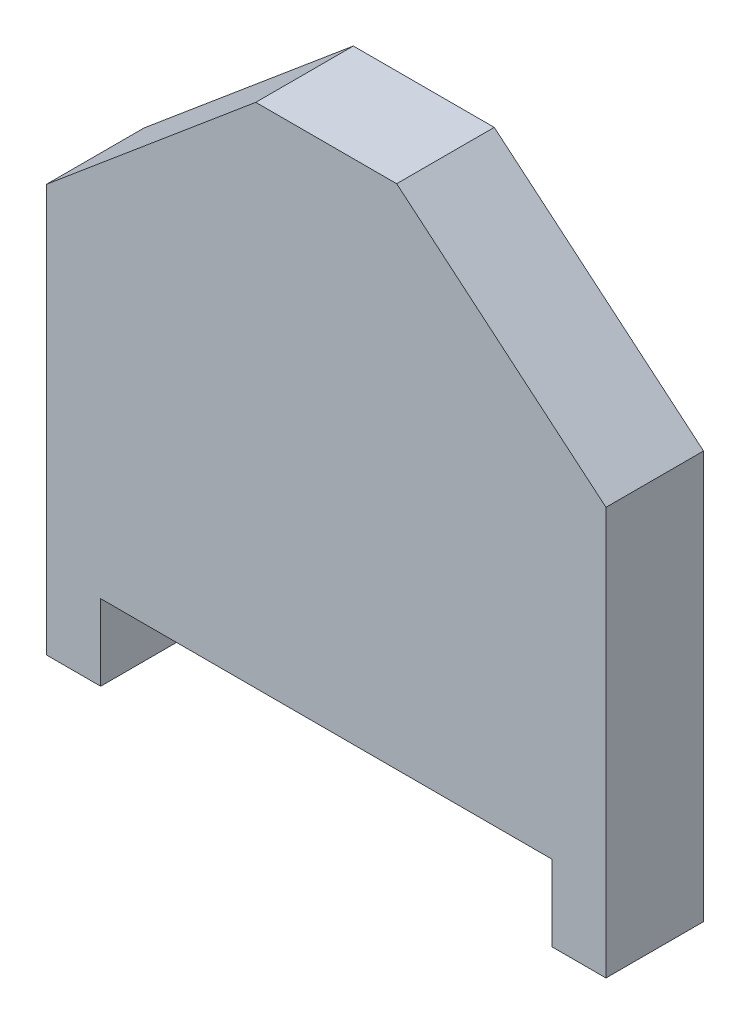
ISO-10303-21;
HEADER;
FILE_DESCRIPTION(('STEP AP214'),'2;1');
FILE_NAME('part.step','',(''),(''),'','','');
FILE_SCHEMA(('AUTOMOTIVE_DESIGN { 1 0 10303 214 1 1 1 1 }'));
ENDSEC;
DATA;
#1=APPLICATION_CONTEXT('core data for automotive mechanical design processes');
#2=APPLICATION_PROTOCOL_DEFINITION('international standard','automotive_design',2000,#1);
#3=PRODUCT_CONTEXT('',#1,'mechanical');
#4=PRODUCT('Part','Part','',(#3));
#5=PRODUCT_RELATED_PRODUCT_CATEGORY('part','',(#4));
#6=PRODUCT_DEFINITION_FORMATION('','',#4);
#7=PRODUCT_DEFINITION_CONTEXT('part definition',#1,'design');
#8=PRODUCT_DEFINITION('design','',#6,#7);
#9=PRODUCT_DEFINITION_SHAPE('','',#8);
#10=(LENGTH_UNIT() NAMED_UNIT(*) SI_UNIT(.MILLI.,.METRE.));
#11=(NAMED_UNIT(*) PLANE_ANGLE_UNIT() SI_UNIT($,.RADIAN.));
#12=(NAMED_UNIT(*) SI_UNIT($,.STERADIAN.) SOLID_ANGLE_UNIT());
#13=UNCERTAINTY_MEASURE_WITH_UNIT(LENGTH_MEASURE(1.E-05),#10,'distance_accuracy_value','');
#14=(GEOMETRIC_REPRESENTATION_CONTEXT(3) GLOBAL_UNCERTAINTY_ASSIGNED_CONTEXT((#13)) GLOBAL_UNIT_ASSIGNED_CONTEXT((#10,
#11,#12)) REPRESENTATION_CONTEXT('',''));
#15=CARTESIAN_POINT('',(0.,0.,0.));
#16=DIRECTION('',(0.,0.,1.));
#17=DIRECTION('',(1.,0.,0.));
#18=AXIS2_PLACEMENT_3D('',#15,#16,#17);
#19=CARTESIAN_POINT('',(362.665793884374,-432.20826277273,45.));
#20=DIRECTION('',(-0.642787609686543,0.766044443118975,0.));
#21=DIRECTION('',(-0.766044443118975,-0.642787609686543,0.));
#22=AXIS2_PLACEMENT_3D('',#19,#20,#21);
#23=PLANE('',#22);
#24=DIRECTION('',(0.766044443118975,0.642787609686543,0.));
#25=VECTOR('',#24,1.);
#26=CARTESIAN_POINT('',(362.665793884374,-432.20826277273,-45.));
#27=LINE('',#26,#25);
#28=CARTESIAN_POINT('',(0.,-736.520996661727,-45.));
#29=VERTEX_POINT('',#28);
#30=CARTESIAN_POINT('',(193.043199665982,-574.538519020718,-45.));
#31=VERTEX_POINT('',#30);
#32=EDGE_CURVE('E144',#29,#31,#27,.T.);
#33=ORIENTED_EDGE('',*,*,#32,.F.);
#34=DIRECTION('',(0.,0.,-1.));
#35=VECTOR('',#34,1.);
#36=CARTESIAN_POINT('',(0.,-736.520996661727,45.));
#37=LINE('',#36,#35);
#38=CARTESIAN_POINT('',(0.,-736.520996661727,45.));
#39=VERTEX_POINT('',#38);
#40=EDGE_CURVE('E11',#39,#29,#37,.T.);
#41=ORIENTED_EDGE('',*,*,#40,.F.);
#42=DIRECTION('',(0.766044443118975,0.642787609686543,0.));
#43=VECTOR('',#42,1.);
#44=CARTESIAN_POINT('',(362.665793884374,-432.20826277273,45.));
#45=LINE('',#44,#43);
#46=CARTESIAN_POINT('',(193.043199665982,-574.538519020718,45.));
#47=VERTEX_POINT('',#46);
#48=EDGE_CURVE('E168',#39,#47,#45,.T.);
#49=ORIENTED_EDGE('',*,*,#48,.T.);
#50=DIRECTION('',(0.,0.,-1.));
#51=VECTOR('',#50,1.);
#52=CARTESIAN_POINT('',(193.043199665982,-574.538519020718,45.));
#53=LINE('',#52,#51);
#54=EDGE_CURVE('E52',#47,#31,#53,.T.);
#55=ORIENTED_EDGE('',*,*,#54,.T.);
#56=EDGE_LOOP('',(#33,#41,#49,#55));
#57=FACE_BOUND('',#56,.T.);
#58=ADVANCED_FACE('F36',(#57),#23,.T.);
#59=CARTESIAN_POINT('',(0.,0.,45.));
#60=DIRECTION('',(1.,0.,0.));
#61=DIRECTION('',(0.,0.,-1.));
#62=AXIS2_PLACEMENT_3D('',#59,#60,#61);
#63=PLANE('',#62);
#64=DIRECTION('',(0.,-1.,0.));
#65=VECTOR('',#64,1.);
#66=CARTESIAN_POINT('',(0.,0.,-45.));
#67=LINE('',#66,#65);
#68=CARTESIAN_POINT('',(0.,-1112.52099666173,-45.));
#69=VERTEX_POINT('',#68);
#70=EDGE_CURVE('E146',#29,#69,#67,.T.);
#71=ORIENTED_EDGE('',*,*,#70,.T.);
#72=DIRECTION('',(0.,0.,-1.));
#73=VECTOR('',#72,1.);
#74=CARTESIAN_POINT('',(0.,-1112.52099666173,45.));
#75=LINE('',#74,#73);
#76=CARTESIAN_POINT('',(0.,-1112.52099666173,45.));
#77=VERTEX_POINT('',#76);
#78=EDGE_CURVE('E44',#77,#69,#75,.T.);
#79=ORIENTED_EDGE('',*,*,#78,.F.);
#80=DIRECTION('',(0.,-1.,0.));
#81=VECTOR('',#80,1.);
#82=CARTESIAN_POINT('',(0.,0.,45.));
#83=LINE('',#82,#81);
#84=EDGE_CURVE('E204',#39,#77,#83,.T.);
#85=ORIENTED_EDGE('',*,*,#84,.F.);
#86=ORIENTED_EDGE('',*,*,#40,.T.);
#87=EDGE_LOOP('',(#71,#79,#85,#86));
#88=FACE_BOUND('',#87,.T.);
#89=ADVANCED_FACE('F225',(#88),#63,.F.);
#90=CARTESIAN_POINT('',(0.,-1112.52099666173,45.));
#91=DIRECTION('',(0.,1.,0.));
#92=DIRECTION('',(0.,0.,1.));
#93=AXIS2_PLACEMENT_3D('',#90,#91,#92);
#94=PLANE('',#93);
#95=DIRECTION('',(1.,0.,0.));
#96=VECTOR('',#95,1.);
#97=CARTESIAN_POINT('',(0.,-1112.52099666173,-45.));
#98=LINE('',#97,#96);
#99=CARTESIAN_POINT('',(50.,-1112.52099666173,-45.));
#100=VERTEX_POINT('',#99);
#101=EDGE_CURVE('E148',#69,#100,#98,.T.);
#102=ORIENTED_EDGE('',*,*,#101,.T.);
#103=DIRECTION('',(0.,0.,-1.));
#104=VECTOR('',#103,1.);
#105=CARTESIAN_POINT('',(50.,-1112.52099666173,45.));
#106=LINE('',#105,#104);
#107=CARTESIAN_POINT('',(50.,-1112.52099666173,45.));
#108=VERTEX_POINT('',#107);
#109=EDGE_CURVE('E178',#108,#100,#106,.T.);
#110=ORIENTED_EDGE('',*,*,#109,.F.);
#111=DIRECTION('',(1.,0.,0.));
#112=VECTOR('',#111,1.);
#113=CARTESIAN_POINT('',(0.,-1112.52099666173,45.));
#114=LINE('',#113,#112);
#115=EDGE_CURVE('E187',#77,#108,#114,.T.);
#116=ORIENTED_EDGE('',*,*,#115,.F.);
#117=ORIENTED_EDGE('',*,*,#78,.T.);
#118=EDGE_LOOP('',(#102,#110,#116,#117));
#119=FACE_BOUND('',#118,.T.);
#120=ADVANCED_FACE('F185',(#119),#94,.F.);
#121=CARTESIAN_POINT('',(50.,0.,45.));
#122=DIRECTION('',(-1.,0.,0.));
#123=DIRECTION('',(0.,0.,1.));
#124=AXIS2_PLACEMENT_3D('',#121,#122,#123);
#125=PLANE('',#124);
#126=DIRECTION('',(0.,1.,0.));
#127=VECTOR('',#126,1.);
#128=CARTESIAN_POINT('',(50.,0.,-45.));
#129=LINE('',#128,#127);
#130=CARTESIAN_POINT('',(50.,-1042.52099666173,-45.));
#131=VERTEX_POINT('',#130);
#132=EDGE_CURVE('E150',#100,#131,#129,.T.);
#133=ORIENTED_EDGE('',*,*,#132,.T.);
#134=DIRECTION('',(0.,0.,-1.));
#135=VECTOR('',#134,1.);
#136=CARTESIAN_POINT('',(50.,-1042.52099666173,45.));
#137=LINE('',#136,#135);
#138=CARTESIAN_POINT('',(50.,-1042.52099666173,45.));
#139=VERTEX_POINT('',#138);
#140=EDGE_CURVE('E176',#139,#131,#137,.T.);
#141=ORIENTED_EDGE('',*,*,#140,.F.);
#142=DIRECTION('',(0.,1.,0.));
#143=VECTOR('',#142,1.);
#144=CARTESIAN_POINT('',(50.,0.,45.));
#145=LINE('',#144,#143);
#146=EDGE_CURVE('E199',#108,#139,#145,.T.);
#147=ORIENTED_EDGE('',*,*,#146,.F.);
#148=ORIENTED_EDGE('',*,*,#109,.T.);
#149=EDGE_LOOP('',(#133,#141,#147,#148));
#150=FACE_BOUND('',#149,.T.);
#151=ADVANCED_FACE('F196',(#150),#125,.F.);
#152=CARTESIAN_POINT('',(1.19914176324439E-12,-1042.52099666173,45.));
#153=DIRECTION('',(0.,-1.,0.));
#154=DIRECTION('',(1.,0.,0.));
#155=AXIS2_PLACEMENT_3D('',#152,#153,#154);
#156=PLANE('',#155);
#157=DIRECTION('',(-1.,0.,0.));
#158=VECTOR('',#157,1.);
#159=CARTESIAN_POINT('',(1.19914176324439E-12,-1042.52099666173,-45.));
#160=LINE('',#159,#158);
#161=CARTESIAN_POINT('',(466.086399331963,-1042.52099666173,-45.));
#162=VERTEX_POINT('',#161);
#163=EDGE_CURVE('E153',#162,#131,#160,.T.);
#164=ORIENTED_EDGE('',*,*,#163,.F.);
#165=DIRECTION('',(0.,0.,-1.));
#166=VECTOR('',#165,1.);
#167=CARTESIAN_POINT('',(466.086399331963,-1042.52099666173,45.));
#168=LINE('',#167,#166);
#169=CARTESIAN_POINT('',(466.086399331963,-1042.52099666173,45.));
#170=VERTEX_POINT('',#169);
#171=EDGE_CURVE('E174',#170,#162,#168,.T.);
#172=ORIENTED_EDGE('',*,*,#171,.F.);
#173=DIRECTION('',(-1.,0.,0.));
#174=VECTOR('',#173,1.);
#175=CARTESIAN_POINT('',(1.19914176324439E-12,-1042.52099666173,45.));
#176=LINE('',#175,#174);
#177=EDGE_CURVE('E201',#170,#139,#176,.T.);
#178=ORIENTED_EDGE('',*,*,#177,.T.);
#179=ORIENTED_EDGE('',*,*,#140,.T.);
#180=EDGE_LOOP('',(#164,#172,#178,#179));
#181=FACE_BOUND('',#180,.T.);
#182=ADVANCED_FACE('F236',(#181),#156,.T.);
#183=CARTESIAN_POINT('',(466.086399331963,0.,45.));
#184=DIRECTION('',(-1.,0.,0.));
#185=DIRECTION('',(0.,0.,1.));
#186=AXIS2_PLACEMENT_3D('',#183,#184,#185);
#187=PLANE('',#186);
#188=DIRECTION('',(0.,1.,0.));
#189=VECTOR('',#188,1.);
#190=CARTESIAN_POINT('',(466.086399331963,0.,-45.));
#191=LINE('',#190,#189);
#192=CARTESIAN_POINT('',(466.086399331963,-1112.52099666173,-45.));
#193=VERTEX_POINT('',#192);
#194=EDGE_CURVE('E156',#193,#162,#191,.T.);
#195=ORIENTED_EDGE('',*,*,#194,.F.);
#196=DIRECTION('',(0.,0.,-1.));
#197=VECTOR('',#196,1.);
#198=CARTESIAN_POINT('',(466.086399331963,-1112.52099666173,45.));
#199=LINE('',#198,#197);
#200=CARTESIAN_POINT('',(466.086399331963,-1112.52099666173,45.));
#201=VERTEX_POINT('',#200);
#202=EDGE_CURVE('E172',#201,#193,#199,.T.);
#203=ORIENTED_EDGE('',*,*,#202,.F.);
#204=DIRECTION('',(0.,1.,0.));
#205=VECTOR('',#204,1.);
#206=CARTESIAN_POINT('',(466.086399331963,0.,45.));
#207=LINE('',#206,#205);
#208=EDGE_CURVE('E139',#201,#170,#207,.T.);
#209=ORIENTED_EDGE('',*,*,#208,.T.);
#210=ORIENTED_EDGE('',*,*,#171,.T.);
#211=EDGE_LOOP('',(#195,#203,#209,#210));
#212=FACE_BOUND('',#211,.T.);
#213=ADVANCED_FACE('F210',(#212),#187,.T.);
#214=CARTESIAN_POINT('',(0.,-1112.52099666173,45.));
#215=DIRECTION('',(0.,-1.,0.));
#216=DIRECTION('',(0.,0.,-1.));
#217=AXIS2_PLACEMENT_3D('',#214,#215,#216);
#218=PLANE('',#217);
#219=DIRECTION('',(-1.,0.,0.));
#220=VECTOR('',#219,1.);
#221=CARTESIAN_POINT('',(0.,-1112.52099666173,-45.));
#222=LINE('',#221,#220);
#223=CARTESIAN_POINT('',(516.086399331963,-1112.52099666173,-45.));
#224=VERTEX_POINT('',#223);
#225=EDGE_CURVE('E159',#224,#193,#222,.T.);
#226=ORIENTED_EDGE('',*,*,#225,.F.);
#227=DIRECTION('',(0.,0.,-1.));
#228=VECTOR('',#227,1.);
#229=CARTESIAN_POINT('',(516.086399331963,-1112.52099666173,45.));
#230=LINE('',#229,#228);
#231=CARTESIAN_POINT('',(516.086399331963,-1112.52099666173,45.));
#232=VERTEX_POINT('',#231);
#233=EDGE_CURVE('E124',#232,#224,#230,.T.);
#234=ORIENTED_EDGE('',*,*,#233,.F.);
#235=DIRECTION('',(-1.,0.,0.));
#236=VECTOR('',#235,1.);
#237=CARTESIAN_POINT('',(0.,-1112.52099666173,45.));
#238=LINE('',#237,#236);
#239=EDGE_CURVE('E137',#232,#201,#238,.T.);
#240=ORIENTED_EDGE('',*,*,#239,.T.);
#241=ORIENTED_EDGE('',*,*,#202,.T.);
#242=EDGE_LOOP('',(#226,#234,#240,#241));
#243=FACE_BOUND('',#242,.T.);
#244=ADVANCED_FACE('F213',(#243),#218,.T.);
#245=CARTESIAN_POINT('',(516.086399331963,0.,45.));
#246=DIRECTION('',(1.,0.,0.));
#247=DIRECTION('',(0.,0.,-1.));
#248=AXIS2_PLACEMENT_3D('',#245,#246,#247);
#249=PLANE('',#248);
#250=DIRECTION('',(0.,-1.,0.));
#251=VECTOR('',#250,1.);
#252=CARTESIAN_POINT('',(516.086399331963,0.,-45.));
#253=LINE('',#252,#251);
#254=CARTESIAN_POINT('',(516.086399331963,-736.520996661727,-45.));
#255=VERTEX_POINT('',#254);
#256=EDGE_CURVE('E121',#255,#224,#253,.T.);
#257=ORIENTED_EDGE('',*,*,#256,.F.);
#258=DIRECTION('',(0.,0.,-1.));
#259=VECTOR('',#258,1.);
#260=CARTESIAN_POINT('',(516.086399331963,-736.520996661727,45.));
#261=LINE('',#260,#259);
#262=CARTESIAN_POINT('',(516.086399331963,-736.520996661727,45.));
#263=VERTEX_POINT('',#262);
#264=EDGE_CURVE('E115',#263,#255,#261,.T.);
#265=ORIENTED_EDGE('',*,*,#264,.F.);
#266=DIRECTION('',(0.,-1.,0.));
#267=VECTOR('',#266,1.);
#268=CARTESIAN_POINT('',(516.086399331963,0.,45.));
#269=LINE('',#268,#267);
#270=EDGE_CURVE('E119',#263,#232,#269,.T.);
#271=ORIENTED_EDGE('',*,*,#270,.T.);
#272=ORIENTED_EDGE('',*,*,#233,.T.);
#273=EDGE_LOOP('',(#257,#265,#271,#272));
#274=FACE_BOUND('',#273,.T.);
#275=ADVANCED_FACE('F117',(#274),#249,.T.);
#276=CARTESIAN_POINT('',(-149.431325599732,-178.085319129594,45.));
#277=DIRECTION('',(-0.642787609686543,-0.766044443118975,0.));
#278=DIRECTION('',(0.766044443118975,-0.642787609686543,0.));
#279=AXIS2_PLACEMENT_3D('',#276,#277,#278);
#280=PLANE('',#279);
#281=DIRECTION('',(-0.766044443118975,0.642787609686543,0.));
#282=VECTOR('',#281,1.);
#283=CARTESIAN_POINT('',(-149.431325599732,-178.085319129594,-45.));
#284=LINE('',#283,#282);
#285=CARTESIAN_POINT('',(323.043199665982,-574.538519020718,-45.));
#286=VERTEX_POINT('',#285);
#287=EDGE_CURVE('E163',#255,#286,#284,.T.);
#288=ORIENTED_EDGE('',*,*,#287,.T.);
#289=DIRECTION('',(0.,0.,-1.));
#290=VECTOR('',#289,1.);
#291=CARTESIAN_POINT('',(323.043199665982,-574.538519020718,45.));
#292=LINE('',#291,#290);
#293=CARTESIAN_POINT('',(323.043199665982,-574.538519020718,45.));
#294=VERTEX_POINT('',#293);
#295=EDGE_CURVE('E84',#294,#286,#292,.T.);
#296=ORIENTED_EDGE('',*,*,#295,.F.);
#297=DIRECTION('',(-0.766044443118975,0.642787609686543,0.));
#298=VECTOR('',#297,1.);
#299=CARTESIAN_POINT('',(-149.431325599732,-178.085319129594,45.));
#300=LINE('',#299,#298);
#301=EDGE_CURVE('E126',#263,#294,#300,.T.);
#302=ORIENTED_EDGE('',*,*,#301,.F.);
#303=ORIENTED_EDGE('',*,*,#264,.T.);
#304=EDGE_LOOP('',(#288,#296,#302,#303));
#305=FACE_BOUND('',#304,.T.);
#306=ADVANCED_FACE('F127',(#305),#280,.F.);
#307=CARTESIAN_POINT('',(0.,-574.538519020718,45.));
#308=DIRECTION('',(0.,1.,0.));
#309=DIRECTION('',(0.,0.,1.));
#310=AXIS2_PLACEMENT_3D('',#307,#308,#309);
#311=PLANE('',#310);
#312=DIRECTION('',(1.,0.,0.));
#313=VECTOR('',#312,1.);
#314=CARTESIAN_POINT('',(0.,-574.538519020718,-45.));
#315=LINE('',#314,#313);
#316=EDGE_CURVE('E165',#31,#286,#315,.T.);
#317=ORIENTED_EDGE('',*,*,#316,.F.);
#318=ORIENTED_EDGE('',*,*,#54,.F.);
#319=DIRECTION('',(1.,0.,0.));
#320=VECTOR('',#319,1.);
#321=CARTESIAN_POINT('',(0.,-574.538519020718,45.));
#322=LINE('',#321,#320);
#323=EDGE_CURVE('E130',#47,#294,#322,.T.);
#324=ORIENTED_EDGE('',*,*,#323,.T.);
#325=ORIENTED_EDGE('',*,*,#295,.T.);
#326=EDGE_LOOP('',(#317,#318,#324,#325));
#327=FACE_BOUND('',#326,.T.);
#328=ADVANCED_FACE('F214',(#327),#311,.T.);
#329=CARTESIAN_POINT('',(0.,0.,45.));
#330=DIRECTION('',(0.,0.,1.));
#331=DIRECTION('',(1.,0.,0.));
#332=AXIS2_PLACEMENT_3D('',#329,#330,#331);
#333=PLANE('',#332);
#334=ORIENTED_EDGE('',*,*,#48,.F.);
#335=ORIENTED_EDGE('',*,*,#84,.T.);
#336=ORIENTED_EDGE('',*,*,#115,.T.);
#337=ORIENTED_EDGE('',*,*,#146,.T.);
#338=ORIENTED_EDGE('',*,*,#177,.F.);
#339=ORIENTED_EDGE('',*,*,#208,.F.);
#340=ORIENTED_EDGE('',*,*,#239,.F.);
#341=ORIENTED_EDGE('',*,*,#270,.F.);
#342=ORIENTED_EDGE('',*,*,#301,.T.);
#343=ORIENTED_EDGE('',*,*,#323,.F.);
#344=EDGE_LOOP('',(#334,#335,#336,#337,#338,#339,#340,#341,#342,#343));
#345=FACE_BOUND('',#344,.T.);
#346=ADVANCED_FACE('F134',(#345),#333,.T.);
#347=CARTESIAN_POINT('',(0.,0.,-45.));
#348=DIRECTION('',(0.,0.,1.));
#349=DIRECTION('',(1.,0.,0.));
#350=AXIS2_PLACEMENT_3D('',#347,#348,#349);
#351=PLANE('',#350);
#352=ORIENTED_EDGE('',*,*,#32,.T.);
#353=ORIENTED_EDGE('',*,*,#316,.T.);
#354=ORIENTED_EDGE('',*,*,#287,.F.);
#355=ORIENTED_EDGE('',*,*,#256,.T.);
#356=ORIENTED_EDGE('',*,*,#225,.T.);
#357=ORIENTED_EDGE('',*,*,#194,.T.);
#358=ORIENTED_EDGE('',*,*,#163,.T.);
#359=ORIENTED_EDGE('',*,*,#132,.F.);
#360=ORIENTED_EDGE('',*,*,#101,.F.);
#361=ORIENTED_EDGE('',*,*,#70,.F.);
#362=EDGE_LOOP('',(#352,#353,#354,#355,#356,#357,#358,#359,#360,#361));
#363=FACE_BOUND('',#362,.T.);
#364=ADVANCED_FACE('F192',(#363),#351,.F.);
#365=CLOSED_SHELL('',(#58,#89,#120,#151,#182,#213,#244,#275,#306,#328,#346,#364));
#366=MANIFOLD_SOLID_BREP('B2',#365);
#367=ADVANCED_BREP_SHAPE_REPRESENTATION('',(#18,#366),#14);
#368=SHAPE_DEFINITION_REPRESENTATION(#9,#367);
ENDSEC;
END-ISO-10303-21;
